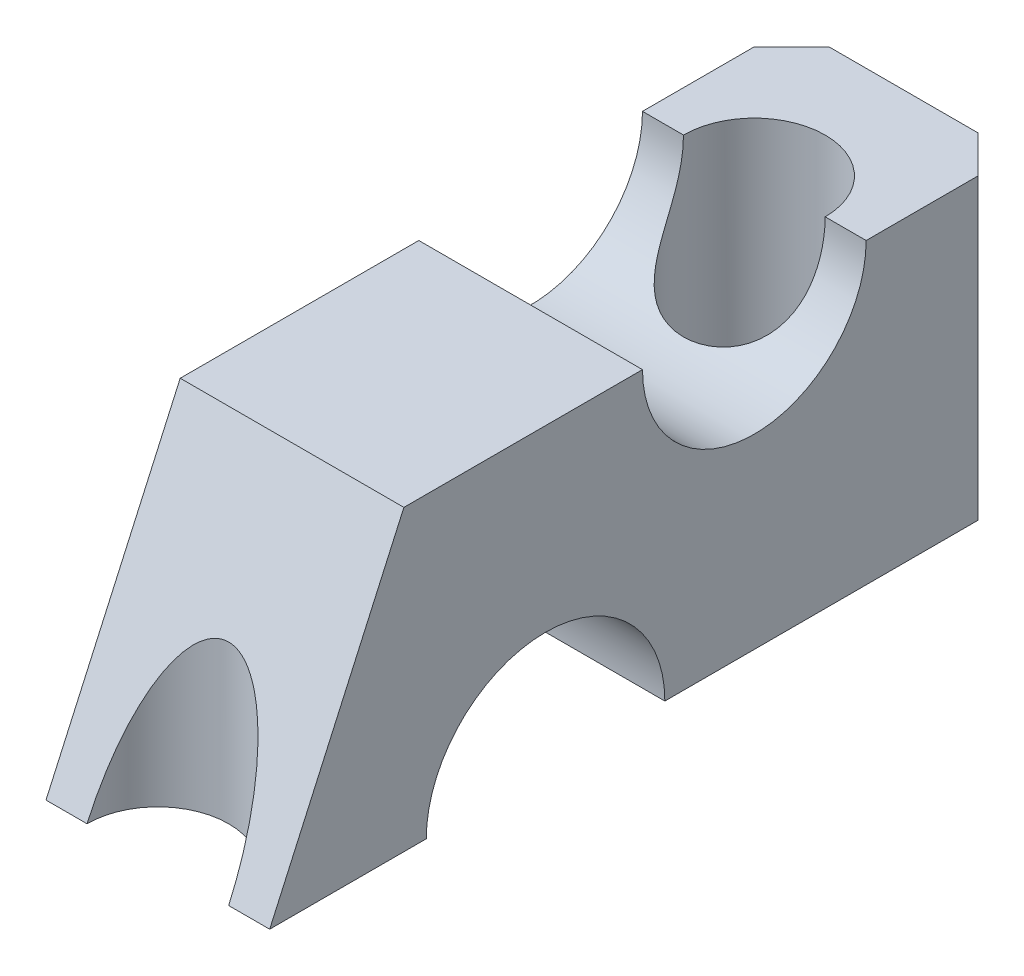
ISO-10303-21;
HEADER;
FILE_DESCRIPTION(('STEP AP214'),'2;1');
FILE_NAME('part.step','',(''),(''),'','','');
FILE_SCHEMA(('AUTOMOTIVE_DESIGN { 1 0 10303 214 1 1 1 1 }'));
ENDSEC;
DATA;
#1=APPLICATION_CONTEXT('core data for automotive mechanical design processes');
#2=APPLICATION_PROTOCOL_DEFINITION('international standard','automotive_design',2000,#1);
#3=PRODUCT_CONTEXT('',#1,'mechanical');
#4=PRODUCT('Part','Part','',(#3));
#5=PRODUCT_RELATED_PRODUCT_CATEGORY('part','',(#4));
#6=PRODUCT_DEFINITION_FORMATION('','',#4);
#7=PRODUCT_DEFINITION_CONTEXT('part definition',#1,'design');
#8=PRODUCT_DEFINITION('design','',#6,#7);
#9=PRODUCT_DEFINITION_SHAPE('','',#8);
#10=(LENGTH_UNIT() NAMED_UNIT(*) SI_UNIT(.MILLI.,.METRE.));
#11=(NAMED_UNIT(*) PLANE_ANGLE_UNIT() SI_UNIT($,.RADIAN.));
#12=(NAMED_UNIT(*) SI_UNIT($,.STERADIAN.) SOLID_ANGLE_UNIT());
#13=UNCERTAINTY_MEASURE_WITH_UNIT(LENGTH_MEASURE(1.E-05),#10,'distance_accuracy_value','');
#14=(GEOMETRIC_REPRESENTATION_CONTEXT(3) GLOBAL_UNCERTAINTY_ASSIGNED_CONTEXT((#13)) GLOBAL_UNIT_ASSIGNED_CONTEXT((#10,
#11,#12)) REPRESENTATION_CONTEXT('',''));
#15=CARTESIAN_POINT('',(0.,0.,0.));
#16=DIRECTION('',(0.,0.,1.));
#17=DIRECTION('',(1.,0.,0.));
#18=AXIS2_PLACEMENT_3D('',#15,#16,#17);
#19=CARTESIAN_POINT('',(30.,40.,0.));
#20=DIRECTION('',(0.,-1.,0.));
#21=DIRECTION('',(0.,0.,-1.));
#22=AXIS2_PLACEMENT_3D('',#19,#20,#21);
#23=PLANE('',#22);
#24=DIRECTION('',(-1.,0.,0.));
#25=VECTOR('',#24,1.);
#26=CARTESIAN_POINT('',(124.,40.,50.));
#27=LINE('',#26,#25);
#28=CARTESIAN_POINT('',(0.,40.,50.));
#29=VERTEX_POINT('',#28);
#30=CARTESIAN_POINT('',(30.,40.,50.));
#31=VERTEX_POINT('',#30);
#32=EDGE_CURVE('E267',#29,#31,#27,.F.);
#33=ORIENTED_EDGE('',*,*,#32,.F.);
#34=DIRECTION('',(0.,0.,1.));
#35=VECTOR('',#34,1.);
#36=CARTESIAN_POINT('',(0.,40.,0.));
#37=LINE('',#36,#35);
#38=CARTESIAN_POINT('',(0.,40.,82.));
#39=VERTEX_POINT('',#38);
#40=EDGE_CURVE('E153',#29,#39,#37,.T.);
#41=ORIENTED_EDGE('',*,*,#40,.T.);
#42=DIRECTION('',(-1.,0.,0.));
#43=VECTOR('',#42,1.);
#44=CARTESIAN_POINT('',(30.,40.,82.));
#45=LINE('',#44,#43);
#46=CARTESIAN_POINT('',(30.,40.,82.));
#47=VERTEX_POINT('',#46);
#48=EDGE_CURVE('E185',#47,#39,#45,.T.);
#49=ORIENTED_EDGE('',*,*,#48,.F.);
#50=DIRECTION('',(0.,0.,1.));
#51=VECTOR('',#50,1.);
#52=CARTESIAN_POINT('',(30.,40.,0.));
#53=LINE('',#52,#51);
#54=EDGE_CURVE('E164',#31,#47,#53,.T.);
#55=ORIENTED_EDGE('',*,*,#54,.F.);
#56=EDGE_LOOP('',(#33,#41,#49,#55));
#57=FACE_BOUND('',#56,.T.);
#58=ADVANCED_FACE('F35',(#57),#23,.F.);
#59=DIRECTION('',(-1.,0.,0.));
#60=VECTOR('',#59,1.);
#61=CARTESIAN_POINT('',(30.,40.,0.));
#62=LINE('',#61,#60);
#63=CARTESIAN_POINT('',(25.,40.,0.));
#64=VERTEX_POINT('',#63);
#65=CARTESIAN_POINT('',(5.,40.,0.));
#66=VERTEX_POINT('',#65);
#67=EDGE_CURVE('E188',#64,#66,#62,.T.);
#68=ORIENTED_EDGE('',*,*,#67,.T.);
#69=DIRECTION('',(0.707106781186546,0.,-0.707106781186549));
#70=VECTOR('',#69,1.);
#71=CARTESIAN_POINT('',(5.,40.,0.));
#72=LINE('',#71,#70);
#73=CARTESIAN_POINT('',(0.,40.,5.00000000000003));
#74=VERTEX_POINT('',#73);
#75=EDGE_CURVE('E247',#66,#74,#72,.F.);
#76=ORIENTED_EDGE('',*,*,#75,.T.);
#77=CARTESIAN_POINT('',(0.,40.,20.));
#78=VERTEX_POINT('',#77);
#79=EDGE_CURVE('E147',#74,#78,#37,.T.);
#80=ORIENTED_EDGE('',*,*,#79,.T.);
#81=DIRECTION('',(-1.,0.,0.));
#82=VECTOR('',#81,1.);
#83=CARTESIAN_POINT('',(124.,40.,20.));
#84=LINE('',#83,#82);
#85=CARTESIAN_POINT('',(5.5,40.,20.));
#86=VERTEX_POINT('',#85);
#87=EDGE_CURVE('E132',#86,#78,#84,.T.);
#88=ORIENTED_EDGE('',*,*,#87,.F.);
#89=CARTESIAN_POINT('',(15.,40.,20.));
#90=DIRECTION('',(0.,-1.,0.));
#91=DIRECTION('',(0.,0.,-1.));
#92=AXIS2_PLACEMENT_3D('',#89,#90,#91);
#93=CIRCLE('',#92,9.5);
#94=CARTESIAN_POINT('',(24.5,40.,20.));
#95=VERTEX_POINT('',#94);
#96=EDGE_CURVE('E146',#95,#86,#93,.F.);
#97=ORIENTED_EDGE('',*,*,#96,.F.);
#98=CARTESIAN_POINT('',(30.,40.,20.));
#99=VERTEX_POINT('',#98);
#100=EDGE_CURVE('E136',#99,#95,#84,.T.);
#101=ORIENTED_EDGE('',*,*,#100,.F.);
#102=CARTESIAN_POINT('',(30.,40.,5.));
#103=VERTEX_POINT('',#102);
#104=EDGE_CURVE('E161',#103,#99,#53,.T.);
#105=ORIENTED_EDGE('',*,*,#104,.F.);
#106=DIRECTION('',(-0.707106781186549,0.,-0.707106781186546));
#107=VECTOR('',#106,1.);
#108=CARTESIAN_POINT('',(30.,40.,5.));
#109=LINE('',#108,#107);
#110=EDGE_CURVE('E249',#103,#64,#109,.T.);
#111=ORIENTED_EDGE('',*,*,#110,.T.);
#112=EDGE_LOOP('',(#68,#76,#80,#88,#97,#101,#105,#111));
#113=FACE_BOUND('',#112,.T.);
#114=ADVANCED_FACE('F145',(#113),#23,.F.);
#115=CARTESIAN_POINT('',(30.,0.,0.));
#116=DIRECTION('',(0.,1.,0.));
#117=DIRECTION('',(0.,0.,1.));
#118=AXIS2_PLACEMENT_3D('',#115,#116,#117);
#119=PLANE('',#118);
#120=CARTESIAN_POINT('',(15.,0.,20.));
#121=DIRECTION('',(0.,1.,0.));
#122=DIRECTION('',(0.,0.,1.));
#123=AXIS2_PLACEMENT_3D('',#120,#121,#122);
#124=CIRCLE('',#123,9.5);
#125=CARTESIAN_POINT('',(15.,0.,29.5));
#126=VERTEX_POINT('',#125);
#127=EDGE_CURVE('E151',#126,#126,#124,.F.);
#128=ORIENTED_EDGE('',*,*,#127,.F.);
#129=EDGE_LOOP('',(#128));
#130=FACE_BOUND('',#129,.T.);
#131=DIRECTION('',(0.,0.,-1.));
#132=VECTOR('',#131,1.);
#133=CARTESIAN_POINT('',(0.,0.,0.));
#134=LINE('',#133,#132);
#135=CARTESIAN_POINT('',(0.,0.,47.));
#136=VERTEX_POINT('',#135);
#137=CARTESIAN_POINT('',(0.,0.,5.00000000000003));
#138=VERTEX_POINT('',#137);
#139=EDGE_CURVE('E175',#136,#138,#134,.T.);
#140=ORIENTED_EDGE('',*,*,#139,.T.);
#141=DIRECTION('',(-0.707106781186546,0.,0.707106781186549));
#142=VECTOR('',#141,1.);
#143=CARTESIAN_POINT('',(5.,0.,0.));
#144=LINE('',#143,#142);
#145=CARTESIAN_POINT('',(5.,0.,0.));
#146=VERTEX_POINT('',#145);
#147=EDGE_CURVE('E44',#138,#146,#144,.F.);
#148=ORIENTED_EDGE('',*,*,#147,.T.);
#149=DIRECTION('',(-1.,0.,0.));
#150=VECTOR('',#149,1.);
#151=CARTESIAN_POINT('',(30.,0.,0.));
#152=LINE('',#151,#150);
#153=CARTESIAN_POINT('',(25.,0.,0.));
#154=VERTEX_POINT('',#153);
#155=EDGE_CURVE('E170',#154,#146,#152,.T.);
#156=ORIENTED_EDGE('',*,*,#155,.F.);
#157=DIRECTION('',(0.707106781186549,0.,0.707106781186546));
#158=VECTOR('',#157,1.);
#159=CARTESIAN_POINT('',(30.,0.,5.));
#160=LINE('',#159,#158);
#161=CARTESIAN_POINT('',(30.,0.,5.));
#162=VERTEX_POINT('',#161);
#163=EDGE_CURVE('E51',#154,#162,#160,.T.);
#164=ORIENTED_EDGE('',*,*,#163,.T.);
#165=DIRECTION('',(0.,0.,-1.));
#166=VECTOR('',#165,1.);
#167=CARTESIAN_POINT('',(30.,0.,0.));
#168=LINE('',#167,#166);
#169=CARTESIAN_POINT('',(30.,0.,47.));
#170=VERTEX_POINT('',#169);
#171=EDGE_CURVE('E166',#170,#162,#168,.T.);
#172=ORIENTED_EDGE('',*,*,#171,.F.);
#173=DIRECTION('',(-1.,0.,0.));
#174=VECTOR('',#173,1.);
#175=CARTESIAN_POINT('',(124.,0.,47.));
#176=LINE('',#175,#174);
#177=EDGE_CURVE('E256',#136,#170,#176,.F.);
#178=ORIENTED_EDGE('',*,*,#177,.F.);
#179=EDGE_LOOP('',(#140,#148,#156,#164,#172,#178));
#180=FACE_BOUND('',#179,.T.);
#181=ADVANCED_FACE('F222',(#130,#180),#119,.F.);
#182=DIRECTION('',(-1.,0.,0.));
#183=VECTOR('',#182,1.);
#184=CARTESIAN_POINT('',(124.,0.,79.));
#185=LINE('',#184,#183);
#186=CARTESIAN_POINT('',(30.,0.,79.));
#187=VERTEX_POINT('',#186);
#188=CARTESIAN_POINT('',(0.,0.,79.));
#189=VERTEX_POINT('',#188);
#190=EDGE_CURVE('E259',#187,#189,#185,.T.);
#191=ORIENTED_EDGE('',*,*,#190,.F.);
#192=CARTESIAN_POINT('',(30.,0.,100.));
#193=VERTEX_POINT('',#192);
#194=EDGE_CURVE('E167',#193,#187,#168,.T.);
#195=ORIENTED_EDGE('',*,*,#194,.F.);
#196=DIRECTION('',(-1.,0.,0.));
#197=VECTOR('',#196,1.);
#198=CARTESIAN_POINT('',(30.,0.,100.));
#199=LINE('',#198,#197);
#200=CARTESIAN_POINT('',(24.5,0.,100.));
#201=VERTEX_POINT('',#200);
#202=EDGE_CURVE('E182',#193,#201,#199,.T.);
#203=ORIENTED_EDGE('',*,*,#202,.T.);
#204=CARTESIAN_POINT('',(15.,0.,100.));
#205=DIRECTION('',(0.,1.,0.));
#206=DIRECTION('',(0.,0.,1.));
#207=AXIS2_PLACEMENT_3D('',#204,#205,#206);
#208=CIRCLE('',#207,9.50000000000001);
#209=CARTESIAN_POINT('',(5.49999999999999,0.,100.));
#210=VERTEX_POINT('',#209);
#211=EDGE_CURVE('E141',#210,#201,#208,.F.);
#212=ORIENTED_EDGE('',*,*,#211,.F.);
#213=CARTESIAN_POINT('',(0.,0.,100.));
#214=VERTEX_POINT('',#213);
#215=EDGE_CURVE('E181',#210,#214,#199,.T.);
#216=ORIENTED_EDGE('',*,*,#215,.T.);
#217=EDGE_CURVE('E176',#214,#189,#134,.T.);
#218=ORIENTED_EDGE('',*,*,#217,.T.);
#219=EDGE_LOOP('',(#191,#195,#203,#212,#216,#218));
#220=FACE_BOUND('',#219,.T.);
#221=ADVANCED_FACE('F281',(#220),#119,.F.);
#222=CARTESIAN_POINT('',(15.,94.,20.));
#223=DIRECTION('',(0.,-1.,0.));
#224=DIRECTION('',(0.,0.,-1.));
#225=AXIS2_PLACEMENT_3D('',#222,#223,#224);
#226=CYLINDRICAL_SURFACE('',#225,9.5);
#227=ORIENTED_EDGE('',*,*,#127,.T.);
#228=EDGE_LOOP('',(#227));
#229=FACE_BOUND('',#228,.T.);
#230=ORIENTED_EDGE('',*,*,#96,.T.);
#231=CARTESIAN_POINT('',(15.,53.9552857369529,29.5));
#232=CARTESIAN_POINT('',(14.7544762232247,53.95528567975,29.5000001159096));
#233=CARTESIAN_POINT('',(14.5089543531506,53.9515427009707,29.4904742032778));
#234=CARTESIAN_POINT('',(14.0196173105251,53.936472271403,29.4524637592219));
#235=CARTESIAN_POINT('',(13.7758021196832,53.9251449020221,29.4239794312895));
#236=CARTESIAN_POINT('',(13.2915975344414,53.8946163536027,29.3483367607816));
#237=CARTESIAN_POINT('',(13.0512079456139,53.8754156232905,29.3011794824388));
#238=CARTESIAN_POINT('',(12.5755470081886,53.828673529006,29.1886752429484));
#239=CARTESIAN_POINT('',(12.3402756613942,53.8011321620949,29.1233282753918));
#240=CARTESIAN_POINT('',(11.8763017252885,53.7370572887173,28.9750700774387));
#241=CARTESIAN_POINT('',(11.6476065023035,53.7005141058336,28.8921399596505));
#242=CARTESIAN_POINT('',(11.1987353311365,53.6177199658218,28.7097115008079));
#243=CARTESIAN_POINT('',(10.9785593642732,53.5714690299828,28.6102131960875));
#244=CARTESIAN_POINT('',(10.5484198267095,53.4684816068328,28.3959009507662));
#245=CARTESIAN_POINT('',(10.3384534982355,53.4117479711515,28.2810911777319));
#246=CARTESIAN_POINT('',(9.93021367314039,53.2869978683727,28.0376453352084));
#247=CARTESIAN_POINT('',(9.73193992279337,53.2189816462267,27.9090095659108));
#248=CARTESIAN_POINT('',(9.35182893377079,53.0722441911343,27.6420648125941));
#249=CARTESIAN_POINT('',(9.16976486612344,52.993731003731,27.5039643722569));
#250=CARTESIAN_POINT('',(8.81937909309046,52.8245734856211,27.2181053588617));
#251=CARTESIAN_POINT('',(8.65105711584402,52.7339293949948,27.0703469769716));
#252=CARTESIAN_POINT('',(8.32903479305941,52.5401703805338,26.7673549023128));
#253=CARTESIAN_POINT('',(8.1753313606361,52.4370581000025,26.6121227981866));
#254=CARTESIAN_POINT('',(7.88303101018962,52.2182139326865,26.296430188818));
#255=CARTESIAN_POINT('',(7.74443420077589,52.1024819551841,26.1359696459964));
#256=CARTESIAN_POINT('',(7.48340537220431,51.8593307166882,25.813226066654));
#257=CARTESIAN_POINT('',(7.36087070453915,51.7319954797976,25.6509626013891));
#258=CARTESIAN_POINT('',(7.13070179106239,51.4653174729815,25.3257708081329));
#259=CARTESIAN_POINT('',(7.02306713106097,51.3259750370065,25.1628424987526));
#260=CARTESIAN_POINT('',(6.82216645859129,51.0357565667013,24.8383335437489));
#261=CARTESIAN_POINT('',(6.7289042816344,50.8848774696579,24.6767532687124));
#262=CARTESIAN_POINT('',(6.55599615368567,50.5722647312072,24.3568200308019));
#263=CARTESIAN_POINT('',(6.47635282307329,50.4105290092125,24.198467694161));
#264=CARTESIAN_POINT('',(6.30484313395299,50.0203692977089,23.8337300370676));
#265=CARTESIAN_POINT('',(6.21798998793243,49.7879290628641,23.6292654067313));
#266=CARTESIAN_POINT('',(6.06423203351488,49.3068440905852,23.232246348133));
#267=CARTESIAN_POINT('',(5.99733280177131,49.0581948467266,23.0396952613227));
#268=CARTESIAN_POINT('',(5.88044399705698,48.5462008437737,22.6686343006258));
#269=CARTESIAN_POINT('',(5.83048418980861,48.2828311540642,22.4901495618906));
#270=CARTESIAN_POINT('',(5.7446813793124,47.7436425691044,22.1494060412717));
#271=CARTESIAN_POINT('',(5.70883893737199,47.4678231793391,21.9871479047503));
#272=CARTESIAN_POINT('',(5.64093937432997,46.8354921190649,21.6420067680682));
#273=CARTESIAN_POINT('',(5.61203663997639,46.4759618849035,21.4640193588047));
#274=CARTESIAN_POINT('',(5.56686445772863,45.7431093843311,21.1371796206339));
#275=CARTESIAN_POINT('',(5.55059792808831,45.3697839528454,20.9883340277831));
#276=CARTESIAN_POINT('',(5.52644858584859,44.6121177111132,20.7210025089884));
#277=CARTESIAN_POINT('',(5.51856685930389,44.227775480518,20.6025205174456));
#278=CARTESIAN_POINT('',(5.50773122543267,43.4507933510421,20.3967970647618));
#279=CARTESIAN_POINT('',(5.50477699495322,43.05815399801,20.3095535552467));
#280=CARTESIAN_POINT('',(5.50118251360024,42.2638896166345,20.1662891739972));
#281=CARTESIAN_POINT('',(5.5005614070652,41.8622173380731,20.1105297941903));
#282=CARTESIAN_POINT('',(5.49997101777365,41.0556746605,20.0317089654767));
#283=CARTESIAN_POINT('',(5.5000017414833,40.6508042298024,20.0086478409391));
#284=CARTESIAN_POINT('',(5.4999986843773,39.8404741901389,19.9953750035187));
#285=CARTESIAN_POINT('',(5.49996489564805,39.4350145149881,20.0051673208089));
#286=CARTESIAN_POINT('',(5.50013860086939,38.6262183003455,20.0575451967918));
#287=CARTESIAN_POINT('',(5.50034609759639,38.2228817853381,20.1001311328295));
#288=CARTESIAN_POINT('',(5.50235492697916,37.404476864765,20.2202414363308));
#289=CARTESIAN_POINT('',(5.50422145922097,36.9896081889934,20.2991307027137));
#290=CARTESIAN_POINT('',(5.51223976436726,36.1679796082734,20.4916003018391));
#291=CARTESIAN_POINT('',(5.51839204025118,35.7612206608555,20.6051847055611));
#292=CARTESIAN_POINT('',(5.53866207670335,34.9589743464815,20.8661416606338));
#293=CARTESIAN_POINT('',(5.55277809630588,34.5634845358073,21.0135068229444));
#294=CARTESIAN_POINT('',(5.59364289948069,33.7869112451928,21.340757129459));
#295=CARTESIAN_POINT('',(5.62038806195786,33.4058236695726,21.5206329429168));
#296=CARTESIAN_POINT('',(5.68372075816207,32.7482004500904,21.8654892489886));
#297=CARTESIAN_POINT('',(5.71656396586046,32.4679900753624,22.0241778993682));
#298=CARTESIAN_POINT('',(5.79577406736766,31.9197077646605,22.3583276627472));
#299=CARTESIAN_POINT('',(5.84213992173473,31.651634897545,22.5337874859045));
#300=CARTESIAN_POINT('',(5.95128439089755,31.1298696238912,22.8994989833533));
#301=CARTESIAN_POINT('',(6.01403728839332,30.8761554357602,23.0897271548412));
#302=CARTESIAN_POINT('',(6.15900303268181,30.3846212591749,23.4829061567093));
#303=CARTESIAN_POINT('',(6.24121197439859,30.1467980934574,23.6858544280018));
#304=CARTESIAN_POINT('',(6.41028864175663,29.7322763175765,24.0621403831157));
#305=CARTESIAN_POINT('',(6.49334170551875,29.5525184887599,24.2338281606583));
#306=CARTESIAN_POINT('',(6.67545872723894,29.2057446087235,24.581540302022));
#307=CARTESIAN_POINT('',(6.77452087711452,29.0387271217285,24.7575641742195));
#308=CARTESIAN_POINT('',(6.98968773634898,28.7183695280708,25.111532950933));
#309=CARTESIAN_POINT('',(7.1057865615001,28.5650247283503,25.2894771726089));
#310=CARTESIAN_POINT('',(7.35574142593014,28.2726394229458,25.6446843188198));
#311=CARTESIAN_POINT('',(7.48959767681971,28.1335990877594,25.82194723521));
#312=CARTESIAN_POINT('',(7.77603211896177,27.8695790319173,26.173816013272));
#313=CARTESIAN_POINT('',(7.92870285004299,27.7446751182475,26.3484035743519));
#314=CARTESIAN_POINT('',(8.25195204109384,27.50986630057,26.690986778138));
#315=CARTESIAN_POINT('',(8.42253076890424,27.3999616209549,26.8589823221992));
#316=CARTESIAN_POINT('',(8.78083845845931,27.1949199244952,27.18545575374));
#317=CARTESIAN_POINT('',(8.96856839961653,27.099783751838,27.3439330968293));
#318=CARTESIAN_POINT('',(9.35996511310902,26.9237507580532,27.6486273929082));
#319=CARTESIAN_POINT('',(9.56363091004375,26.8428530664011,27.7948450951517));
#320=CARTESIAN_POINT('',(9.96705479692447,26.7009439964987,28.0605619543352));
#321=CARTESIAN_POINT('',(10.1656219002077,26.6388167883255,28.1812784566682));
#322=CARTESIAN_POINT('',(10.5733835936388,26.5250759405395,28.4088987804165));
#323=CARTESIAN_POINT('',(10.7825775005906,26.4734616261199,28.5158034882288));
#324=CARTESIAN_POINT('',(11.2101239108226,26.3799969562568,28.714494515969));
#325=CARTESIAN_POINT('',(11.4284765909807,26.3381467894848,28.8062805437502));
#326=CARTESIAN_POINT('',(11.8727952683788,26.2634834382253,28.9736812474903));
#327=CARTESIAN_POINT('',(12.0987614624545,26.2306704875826,29.0492955049812));
#328=CARTESIAN_POINT('',(12.5579208006952,26.1732788065761,29.18388735359));
#329=CARTESIAN_POINT('',(12.7911456507681,26.1487441972223,29.2427755446138));
#330=CARTESIAN_POINT('',(13.2620582133943,26.1076004571835,29.3427779919946));
#331=CARTESIAN_POINT('',(13.4997459148213,26.0909913067421,29.3838922926578));
#332=CARTESIAN_POINT('',(13.9779842014843,26.065298869606,29.4479465616878));
#333=CARTESIAN_POINT('',(14.2185350857804,26.0562163761949,29.4708846143296));
#334=CARTESIAN_POINT('',(14.7008513300055,26.0453525776541,29.4983608709738));
#335=CARTESIAN_POINT('',(14.9426167108164,26.0435713984951,29.5028987575152));
#336=CARTESIAN_POINT('',(15.4315751483186,26.0473094028597,29.4934170520615));
#337=CARTESIAN_POINT('',(15.6787582512966,26.0530059633247,29.4789465630198));
#338=CARTESIAN_POINT('',(16.1709480930467,26.0721609330156,29.4308018869129));
#339=CARTESIAN_POINT('',(16.415954794774,26.0856194741028,29.3971273736079));
#340=CARTESIAN_POINT('',(16.9020526150997,26.1206459916045,29.3109143954479));
#341=CARTESIAN_POINT('',(17.1431435585963,26.1422143296305,29.2583750894267));
#342=CARTESIAN_POINT('',(17.6196485422926,26.1939829093303,29.1349881539766));
#343=CARTESIAN_POINT('',(17.8550626323406,26.2241830751781,29.0641406853757));
#344=CARTESIAN_POINT('',(18.3182786799328,26.2938534373955,28.9049955513019));
#345=CARTESIAN_POINT('',(18.5460870119636,26.3333156364027,28.8167129506756));
#346=CARTESIAN_POINT('',(18.9925992145774,26.4222918843069,28.6237059083365));
#347=CARTESIAN_POINT('',(19.211303096301,26.4718059209036,28.5189814867435));
#348=CARTESIAN_POINT('',(19.6378923422065,26.5816800905875,28.2944577836535));
#349=CARTESIAN_POINT('',(19.8457812972733,26.6420365936204,28.1746635515354));
#350=CARTESIAN_POINT('',(20.2492848538121,26.7743959226664,27.9215981077928));
#351=CARTESIAN_POINT('',(20.4448998002856,26.8463984211269,27.7883272752477));
#352=CARTESIAN_POINT('',(20.8177212769457,27.0007638056522,27.5137445268015));
#353=CARTESIAN_POINT('',(20.9952683947441,27.0828183774502,27.3727214700649));
#354=CARTESIAN_POINT('',(21.3363842574314,27.2591412795903,27.0817014816349));
#355=CARTESIAN_POINT('',(21.4999533572667,27.3534092996411,26.9317047779756));
#356=CARTESIAN_POINT('',(21.812333135589,27.5544292311561,26.624955147402));
#357=CARTESIAN_POINT('',(21.9611469973513,27.6611784390686,26.4682036882641));
#358=CARTESIAN_POINT('',(22.2436404450633,27.8872372610742,26.1501961198563));
#359=CARTESIAN_POINT('',(22.3773198410463,28.0065470327904,25.9889399540753));
#360=CARTESIAN_POINT('',(22.6292232459533,28.2572925342855,25.664542989636));
#361=CARTESIAN_POINT('',(22.7474779596214,28.3887032571605,25.5014066610833));
#362=CARTESIAN_POINT('',(22.9691292625767,28.6634549475144,25.1751216803884));
#363=CARTESIAN_POINT('',(23.0725261994122,28.8067956358075,25.0119730286239));
#364=CARTESIAN_POINT('',(23.2651014350615,29.1049021058002,24.6876106371166));
#365=CARTESIAN_POINT('',(23.3542738432567,29.2596725821551,24.5263977244197));
#366=CARTESIAN_POINT('',(23.5192145304541,29.5799007297423,24.207753070973));
#367=CARTESIAN_POINT('',(23.5949801774361,29.7453604908143,24.0503220779223));
#368=CARTESIAN_POINT('',(23.759089387291,30.1473129771475,23.685307876153));
#369=CARTESIAN_POINT('',(23.8422044841195,30.3880056709581,23.4799785999648));
#370=CARTESIAN_POINT('',(23.9885513788597,30.885662086084,23.0823491438387));
#371=CARTESIAN_POINT('',(24.051776887438,31.1426309233207,22.89005310022));
#372=CARTESIAN_POINT('',(24.1615226672424,31.671138255338,22.5206510506982));
#373=CARTESIAN_POINT('',(24.2080207750847,31.942695536223,22.3435654328473));
#374=CARTESIAN_POINT('',(24.2872718426059,32.4981516954281,22.0066243314345));
#375=CARTESIAN_POINT('',(24.3200255588342,32.7820498935024,21.8467678998654));
#376=CARTESIAN_POINT('',(24.3751729081611,33.3655853650899,21.5428577183858));
#377=CARTESIAN_POINT('',(24.3973727952089,33.6654123326455,21.3991339644833));
#378=CARTESIAN_POINT('',(24.4333068747102,34.2743608835453,21.131775589651));
#379=CARTESIAN_POINT('',(24.4470410581143,34.5834824768245,21.0081409901956));
#380=CARTESIAN_POINT('',(24.4684695653989,35.2093739794015,20.7816796292658));
#381=CARTESIAN_POINT('',(24.4761652044261,35.5261422078234,20.6788483406189));
#382=CARTESIAN_POINT('',(24.4875720415375,36.1658935041559,20.4944673305582));
#383=CARTESIAN_POINT('',(24.4912828880929,36.488877117815,20.4129194871995));
#384=CARTESIAN_POINT('',(24.496935382344,37.2096160579926,20.2562754134674));
#385=CARTESIAN_POINT('',(24.4983246337649,37.6085081461204,20.1863418093685));
#386=CARTESIAN_POINT('',(24.4998232196233,38.410669118019,20.0789469871521));
#387=CARTESIAN_POINT('',(24.4999324045671,38.8139385074922,20.0414895622667));
#388=CARTESIAN_POINT('',(24.5000238416138,39.6224514516043,19.9992860871125));
#389=CARTESIAN_POINT('',(24.5000060120929,40.0276961084527,19.9945610756779));
#390=CARTESIAN_POINT('',(24.4999898953078,40.8372272478044,20.0179097232105));
#391=CARTESIAN_POINT('',(24.4999916077203,41.2415137460491,20.0459828395532));
#392=CARTESIAN_POINT('',(24.4991313809981,42.0631643624596,20.1365829579804));
#393=CARTESIAN_POINT('',(24.4982336945053,42.4803772170142,20.2004878348358));
#394=CARTESIAN_POINT('',(24.4934020613613,43.3079691584045,20.3632242497421));
#395=CARTESIAN_POINT('',(24.4894677753716,43.7183474762479,20.4620596905969));
#396=CARTESIAN_POINT('',(24.4753349016961,44.5291827112235,20.6939072034851));
#397=CARTESIAN_POINT('',(24.4651370442476,44.9296407792451,20.8269152904558));
#398=CARTESIAN_POINT('',(24.4342283907079,45.7175462189215,21.1260276611736));
#399=CARTESIAN_POINT('',(24.413520103364,46.1049966718617,21.292124041291));
#400=CARTESIAN_POINT('',(24.3622814242374,46.7854636794863,21.6183299062162));
#401=CARTESIAN_POINT('',(24.3346520889383,47.0814955834033,21.7726278788739));
#402=CARTESIAN_POINT('',(24.266511518604,47.6615306204559,22.099931022559));
#403=CARTESIAN_POINT('',(24.226001034131,47.9455344533541,22.2729351032266));
#404=CARTESIAN_POINT('',(24.12896047443,48.4991282861216,22.6357702381109));
#405=CARTESIAN_POINT('',(24.0724551548369,48.7687398008528,22.8255749799001));
#406=CARTESIAN_POINT('',(23.9400628394136,49.2918911020499,23.2200180888032));
#407=CARTESIAN_POINT('',(23.8641801622419,49.5454344539542,23.4246531433958));
#408=CARTESIAN_POINT('',(23.7074194581071,49.984821157917,23.8031414912044));
#409=CARTESIAN_POINT('',(23.6306552547285,50.1739860888323,23.9748504729188));
#410=CARTESIAN_POINT('',(23.4612013694686,50.5396234162372,24.3238504581182));
#411=CARTESIAN_POINT('',(23.3685135568598,50.7160972990835,24.5011408044139));
#412=CARTESIAN_POINT('',(23.1659710594028,51.0552849933737,24.8589242857324));
#413=CARTESIAN_POINT('',(23.0561234682054,51.2180044480907,25.039416070109));
#414=CARTESIAN_POINT('',(22.818307460903,51.5289286817765,25.4010074214993));
#415=CARTESIAN_POINT('',(22.690338849341,51.6771333041565,25.5821069950481));
#416=CARTESIAN_POINT('',(22.4149868129991,51.9592794706334,25.9430454251977));
#417=CARTESIAN_POINT('',(22.2674915951221,52.0931301806617,26.1228702149838));
#418=CARTESIAN_POINT('',(21.9537337818355,52.3452721850883,26.4770007677432));
#419=CARTESIAN_POINT('',(21.7874709146307,52.4635632540965,26.6513064507414));
#420=CARTESIAN_POINT('',(21.4367855815295,52.6846707429793,26.9912387708858));
#421=CARTESIAN_POINT('',(21.2523639965682,52.7874879129288,27.1568658284619));
#422=CARTESIAN_POINT('',(20.8664551842153,52.9780961407929,27.4764598928824));
#423=CARTESIAN_POINT('',(20.6649692263916,53.0658883150827,27.6304277655438));
#424=CARTESIAN_POINT('',(20.2672022518721,53.2191942593901,27.9094648482423));
#425=CARTESIAN_POINT('',(20.072383631086,53.286053551765,28.0358858520933));
#426=CARTESIAN_POINT('',(19.6714548795767,53.40886618701,28.2753866635483));
#427=CARTESIAN_POINT('',(19.4653456412115,53.4648203901792,28.3884675232741));
#428=CARTESIAN_POINT('',(19.0432604793448,53.5665807447444,28.5998702967583));
#429=CARTESIAN_POINT('',(18.827283312773,53.6123856133463,28.698190344363));
#430=CARTESIAN_POINT('',(18.3870251831931,53.6945927415488,28.8788899855886));
#431=CARTESIAN_POINT('',(18.1627438350366,53.7309945644097,28.9612688387501));
#432=CARTESIAN_POINT('',(17.7000626524973,53.7961351762887,29.1115715769876));
#433=CARTESIAN_POINT('',(17.4614408916427,53.8245858909709,29.1789375245733));
#434=CARTESIAN_POINT('',(16.9788308549341,53.8728580050965,29.2949355619474));
#435=CARTESIAN_POINT('',(16.7348424407095,53.8926791817662,29.3435671681002));
#436=CARTESIAN_POINT('',(16.2432699936137,53.9241887327305,29.4215826135891));
#437=CARTESIAN_POINT('',(15.9956856528504,53.9358764063737,29.4509647946921));
#438=CARTESIAN_POINT('',(15.4987335334169,53.9514248750448,29.4901732729037));
#439=CARTESIAN_POINT('',(15.249365783288,53.9552857950508,29.4999998822766));
#440=CARTESIAN_POINT('',(15.,53.9552857369529,29.5));
#441=B_SPLINE_CURVE_WITH_KNOTS('',3,(#231,#232,#233,#234,#235,#236,#237,#238,#239,#240,#241,
#242,#243,#244,#245,#246,#247,#248,#249,#250,#251,#252,#253,#254,#255,#256,#257,#258,#259,#260,
#261,#262,#263,#264,#265,#266,#267,#268,#269,#270,#271,#272,#273,#274,#275,#276,#277,#278,#279,
#280,#281,#282,#283,#284,#285,#286,#287,#288,#289,#290,#291,#292,#293,#294,#295,#296,#297,#298,
#299,#300,#301,#302,#303,#304,#305,#306,#307,#308,#309,#310,#311,#312,#313,#314,#315,#316,#317,
#318,#319,#320,#321,#322,#323,#324,#325,#326,#327,#328,#329,#330,#331,#332,#333,#334,#335,#336,
#337,#338,#339,#340,#341,#342,#343,#344,#345,#346,#347,#348,#349,#350,#351,#352,#353,#354,#355,
#356,#357,#358,#359,#360,#361,#362,#363,#364,#365,#366,#367,#368,#369,#370,#371,#372,#373,#374,
#375,#376,#377,#378,#379,#380,#381,#382,#383,#384,#385,#386,#387,#388,#389,#390,#391,#392,#393,
#394,#395,#396,#397,#398,#399,#400,#401,#402,#403,#404,#405,#406,#407,#408,#409,#410,#411,#412,
#413,#414,#415,#416,#417,#418,#419,#420,#421,#422,#423,#424,#425,#426,#427,#428,#429,#430,#431,
#432,#433,#434,#435,#436,#437,#438,#439,#440),.UNSPECIFIED.,.T.,.F.,(4,2,2,2,2,2,2,2,2,2,2,2,2,
2,2,2,2,2,2,2,2,2,2,2,2,2,2,2,2,2,2,2,2,2,2,2,2,2,2,2,2,2,2,2,2,2,2,2,2,2,2,2,2,2,2,2,2,2,2,2,2,
2,2,2,2,2,2,2,2,2,2,2,2,2,2,2,2,2,2,2,2,2,2,2,2,2,2,2,2,2,2,2,2,2,2,2,2,2,2,2,2,2,2,2,4),(0.,
0.736354869630778,1.47270183566463,2.20900684091326,2.94531210559506,3.68241233521639,
4.41951094839701,5.1564093415971,5.89329173839918,6.61728557013983,7.34126507558424,
8.06509136286317,8.78892285376596,9.50787602716514,10.2268092111181,10.9459339221081,
11.6651968433705,12.6283609509635,13.591793988767,14.5569112889258,15.5220669583431,
16.7270809292935,17.9323731081546,19.1378213853625,20.3431906042666,21.5584290863068,
22.7736796235179,23.989079242487,25.2044928468554,26.4698934309882,27.7354425489063,
29.0007151104174,30.2656251063229,31.2358629408981,32.2060262161028,33.1746760039172,
34.1431315360185,34.9286149461061,35.7140097048168,36.4991338358537,37.284267323852,
38.0734294045413,38.8626032900069,39.6518222691043,40.4409929794836,41.1617714547147,
41.8825036496757,42.6032497701135,43.3240145386503,44.0485622254979,44.7731081062059,
45.4977303418448,46.2223650794528,46.9645031167141,47.7066537618626,48.4488375030366,
49.191014724724,49.9325534510581,50.6740912699809,51.4153812834083,52.1566504510996,
52.8791597720487,53.6016507407313,54.3239854994818,55.0463293239212,55.7672125450515,
56.4880789007728,57.2092430088102,57.9305485393402,58.9104434410907,59.8906478869691,
60.8721463367055,61.8535907535314,62.852416207556,63.8512427292664,64.8498516540951,
65.8485486665897,67.0621093553324,68.2758117694129,69.4902942212018,70.704756580417,
71.9694825656059,73.2343499037603,74.4990698055868,75.7634879717513,76.767509983381,
77.7714735031121,78.773891578801,79.7760864388716,80.5756006306571,81.3750210315181,
82.1741118316641,82.9732112516169,83.777101294343,84.581002980583,85.3848656862859,
86.1886686380671,86.9128274418814,87.6369290938921,88.3611222143856,89.0853489651658,
89.8331546933016,90.580979725095,91.3288691694732,92.0767466714206),.UNSPECIFIED.);
#442=EDGE_CURVE('E129',#86,#95,#441,.T.);
#443=ORIENTED_EDGE('',*,*,#442,.T.);
#444=EDGE_LOOP('',(#230,#443));
#445=FACE_BOUND('',#444,.T.);
#446=ADVANCED_FACE('F149',(#229,#445),#226,.F.);
#447=CARTESIAN_POINT('',(30.,0.,0.));
#448=DIRECTION('',(0.,0.,1.));
#449=DIRECTION('',(1.,0.,0.));
#450=AXIS2_PLACEMENT_3D('',#447,#448,#449);
#451=PLANE('',#450);
#452=ORIENTED_EDGE('',*,*,#155,.T.);
#453=DIRECTION('',(0.,1.,0.));
#454=VECTOR('',#453,1.);
#455=CARTESIAN_POINT('',(5.,0.,0.));
#456=LINE('',#455,#454);
#457=EDGE_CURVE('E243',#146,#66,#456,.T.);
#458=ORIENTED_EDGE('',*,*,#457,.T.);
#459=ORIENTED_EDGE('',*,*,#67,.F.);
#460=DIRECTION('',(0.,-1.,0.));
#461=VECTOR('',#460,1.);
#462=CARTESIAN_POINT('',(25.,0.,0.));
#463=LINE('',#462,#461);
#464=EDGE_CURVE('E251',#64,#154,#463,.T.);
#465=ORIENTED_EDGE('',*,*,#464,.T.);
#466=EDGE_LOOP('',(#452,#458,#459,#465));
#467=FACE_BOUND('',#466,.T.);
#468=ADVANCED_FACE('F228',(#467),#451,.F.);
#469=CARTESIAN_POINT('',(30.,0.,100.));
#470=DIRECTION('',(0.,-0.410364677328798,-0.911921505175106));
#471=DIRECTION('',(0.,0.911921505175107,-0.410364677328798));
#472=AXIS2_PLACEMENT_3D('',#469,#470,#471);
#473=PLANE('',#472);
#474=CARTESIAN_POINT('',(15.,0.,100.));
#475=DIRECTION('',(0.,-0.410364677328798,-0.911921505175106));
#476=DIRECTION('',(0.,-0.911921505175107,0.410364677328798));
#477=AXIS2_PLACEMENT_3D('',#474,#475,#476);
#478=ELLIPSE('',#477,23.150140654987,9.50000000000001);
#479=EDGE_CURVE('E150',#201,#210,#478,.F.);
#480=ORIENTED_EDGE('',*,*,#479,.F.);
#481=ORIENTED_EDGE('',*,*,#202,.F.);
#482=DIRECTION('',(0.,-0.911921505175107,0.410364677328798));
#483=VECTOR('',#482,1.);
#484=CARTESIAN_POINT('',(30.,0.,100.));
#485=LINE('',#484,#483);
#486=EDGE_CURVE('E163',#47,#193,#485,.T.);
#487=ORIENTED_EDGE('',*,*,#486,.F.);
#488=ORIENTED_EDGE('',*,*,#48,.T.);
#489=DIRECTION('',(0.,-0.911921505175107,0.410364677328798));
#490=VECTOR('',#489,1.);
#491=CARTESIAN_POINT('',(0.,0.,100.));
#492=LINE('',#491,#490);
#493=EDGE_CURVE('E172',#39,#214,#492,.T.);
#494=ORIENTED_EDGE('',*,*,#493,.T.);
#495=ORIENTED_EDGE('',*,*,#215,.F.);
#496=EDGE_LOOP('',(#480,#481,#487,#488,#494,#495));
#497=FACE_BOUND('',#496,.T.);
#498=ADVANCED_FACE('F226',(#497),#473,.F.);
#499=CARTESIAN_POINT('',(30.,0.,0.));
#500=DIRECTION('',(1.,0.,0.));
#501=DIRECTION('',(0.,0.,-1.));
#502=AXIS2_PLACEMENT_3D('',#499,#500,#501);
#503=PLANE('',#502);
#504=ORIENTED_EDGE('',*,*,#171,.T.);
#505=DIRECTION('',(0.,1.,0.));
#506=VECTOR('',#505,1.);
#507=CARTESIAN_POINT('',(30.,40.,5.));
#508=LINE('',#507,#506);
#509=EDGE_CURVE('E11',#162,#103,#508,.T.);
#510=ORIENTED_EDGE('',*,*,#509,.T.);
#511=ORIENTED_EDGE('',*,*,#104,.T.);
#512=CARTESIAN_POINT('',(30.,40.,35.));
#513=DIRECTION('',(1.,0.,0.));
#514=DIRECTION('',(0.,0.,-1.));
#515=AXIS2_PLACEMENT_3D('',#512,#513,#514);
#516=CIRCLE('',#515,15.);
#517=EDGE_CURVE('E264',#99,#31,#516,.F.);
#518=ORIENTED_EDGE('',*,*,#517,.T.);
#519=ORIENTED_EDGE('',*,*,#54,.T.);
#520=ORIENTED_EDGE('',*,*,#486,.T.);
#521=ORIENTED_EDGE('',*,*,#194,.T.);
#522=CARTESIAN_POINT('',(30.,0.,63.));
#523=DIRECTION('',(1.,0.,0.));
#524=DIRECTION('',(0.,0.,-1.));
#525=AXIS2_PLACEMENT_3D('',#522,#523,#524);
#526=CIRCLE('',#525,16.);
#527=EDGE_CURVE('E156',#187,#170,#526,.F.);
#528=ORIENTED_EDGE('',*,*,#527,.T.);
#529=EDGE_LOOP('',(#504,#510,#511,#518,#519,#520,#521,#528));
#530=FACE_BOUND('',#529,.T.);
#531=ADVANCED_FACE('F214',(#530),#503,.T.);
#532=CARTESIAN_POINT('',(0.,0.,0.));
#533=DIRECTION('',(1.,0.,0.));
#534=DIRECTION('',(0.,0.,-1.));
#535=AXIS2_PLACEMENT_3D('',#532,#533,#534);
#536=PLANE('',#535);
#537=ORIENTED_EDGE('',*,*,#79,.F.);
#538=DIRECTION('',(0.,-1.,0.));
#539=VECTOR('',#538,1.);
#540=CARTESIAN_POINT('',(0.,0.,5.00000000000003));
#541=LINE('',#540,#539);
#542=EDGE_CURVE('E59',#74,#138,#541,.T.);
#543=ORIENTED_EDGE('',*,*,#542,.T.);
#544=ORIENTED_EDGE('',*,*,#139,.F.);
#545=CARTESIAN_POINT('',(0.,0.,63.));
#546=DIRECTION('',(1.,0.,0.));
#547=DIRECTION('',(0.,0.,-1.));
#548=AXIS2_PLACEMENT_3D('',#545,#546,#547);
#549=CIRCLE('',#548,16.);
#550=EDGE_CURVE('E140',#189,#136,#549,.F.);
#551=ORIENTED_EDGE('',*,*,#550,.F.);
#552=ORIENTED_EDGE('',*,*,#217,.F.);
#553=ORIENTED_EDGE('',*,*,#493,.F.);
#554=ORIENTED_EDGE('',*,*,#40,.F.);
#555=CARTESIAN_POINT('',(0.,40.,35.));
#556=DIRECTION('',(1.,0.,0.));
#557=DIRECTION('',(0.,0.,-1.));
#558=AXIS2_PLACEMENT_3D('',#555,#556,#557);
#559=CIRCLE('',#558,15.);
#560=EDGE_CURVE('E262',#78,#29,#559,.F.);
#561=ORIENTED_EDGE('',*,*,#560,.F.);
#562=EDGE_LOOP('',(#537,#543,#544,#551,#552,#553,#554,#561));
#563=FACE_BOUND('',#562,.T.);
#564=ADVANCED_FACE('F209',(#563),#536,.F.);
#565=CARTESIAN_POINT('',(15.,94.,100.));
#566=DIRECTION('',(0.,-1.,0.));
#567=DIRECTION('',(0.,0.,-1.));
#568=AXIS2_PLACEMENT_3D('',#565,#566,#567);
#569=CYLINDRICAL_SURFACE('',#568,9.50000000000001);
#570=ORIENTED_EDGE('',*,*,#479,.T.);
#571=ORIENTED_EDGE('',*,*,#211,.T.);
#572=EDGE_LOOP('',(#570,#571));
#573=FACE_BOUND('',#572,.T.);
#574=ADVANCED_FACE('F204',(#573),#569,.F.);
#575=CARTESIAN_POINT('',(124.,40.,35.));
#576=DIRECTION('',(-1.,0.,0.));
#577=DIRECTION('',(0.,0.,1.));
#578=AXIS2_PLACEMENT_3D('',#575,#576,#577);
#579=CYLINDRICAL_SURFACE('',#578,15.);
#580=ORIENTED_EDGE('',*,*,#32,.T.);
#581=ORIENTED_EDGE('',*,*,#517,.F.);
#582=ORIENTED_EDGE('',*,*,#100,.T.);
#583=ORIENTED_EDGE('',*,*,#442,.F.);
#584=ORIENTED_EDGE('',*,*,#87,.T.);
#585=ORIENTED_EDGE('',*,*,#560,.T.);
#586=EDGE_LOOP('',(#580,#581,#582,#583,#584,#585));
#587=FACE_BOUND('',#586,.T.);
#588=ADVANCED_FACE('F131',(#587),#579,.F.);
#589=CARTESIAN_POINT('',(124.,0.,63.));
#590=DIRECTION('',(-1.,0.,0.));
#591=DIRECTION('',(0.,0.,1.));
#592=AXIS2_PLACEMENT_3D('',#589,#590,#591);
#593=CYLINDRICAL_SURFACE('',#592,16.);
#594=ORIENTED_EDGE('',*,*,#190,.T.);
#595=ORIENTED_EDGE('',*,*,#550,.T.);
#596=ORIENTED_EDGE('',*,*,#177,.T.);
#597=ORIENTED_EDGE('',*,*,#527,.F.);
#598=EDGE_LOOP('',(#594,#595,#596,#597));
#599=FACE_BOUND('',#598,.T.);
#600=ADVANCED_FACE('F203',(#599),#593,.F.);
#601=CARTESIAN_POINT('',(5.,0.,0.));
#602=DIRECTION('',(0.707106781186549,0.,0.707106781186545));
#603=DIRECTION('',(0.,1.,0.));
#604=AXIS2_PLACEMENT_3D('',#601,#602,#603);
#605=PLANE('',#604);
#606=ORIENTED_EDGE('',*,*,#147,.F.);
#607=ORIENTED_EDGE('',*,*,#542,.F.);
#608=ORIENTED_EDGE('',*,*,#75,.F.);
#609=ORIENTED_EDGE('',*,*,#457,.F.);
#610=EDGE_LOOP('',(#606,#607,#608,#609));
#611=FACE_BOUND('',#610,.T.);
#612=ADVANCED_FACE('F206',(#611),#605,.F.);
#613=CARTESIAN_POINT('',(30.,0.,5.));
#614=DIRECTION('',(0.707106781186545,0.,-0.707106781186549));
#615=DIRECTION('',(0.,-1.,0.));
#616=AXIS2_PLACEMENT_3D('',#613,#614,#615);
#617=PLANE('',#616);
#618=ORIENTED_EDGE('',*,*,#163,.F.);
#619=ORIENTED_EDGE('',*,*,#464,.F.);
#620=ORIENTED_EDGE('',*,*,#110,.F.);
#621=ORIENTED_EDGE('',*,*,#509,.F.);
#622=EDGE_LOOP('',(#618,#619,#620,#621));
#623=FACE_BOUND('',#622,.T.);
#624=ADVANCED_FACE('F38',(#623),#617,.T.);
#625=CLOSED_SHELL('',(#58,#114,#181,#221,#446,#468,#498,#531,#564,#574,#588,#600,#612,#624));
#626=MANIFOLD_SOLID_BREP('B2',#625);
#627=ADVANCED_BREP_SHAPE_REPRESENTATION('',(#18,#626),#14);
#628=SHAPE_DEFINITION_REPRESENTATION(#9,#627);
ENDSEC;
END-ISO-10303-21;
